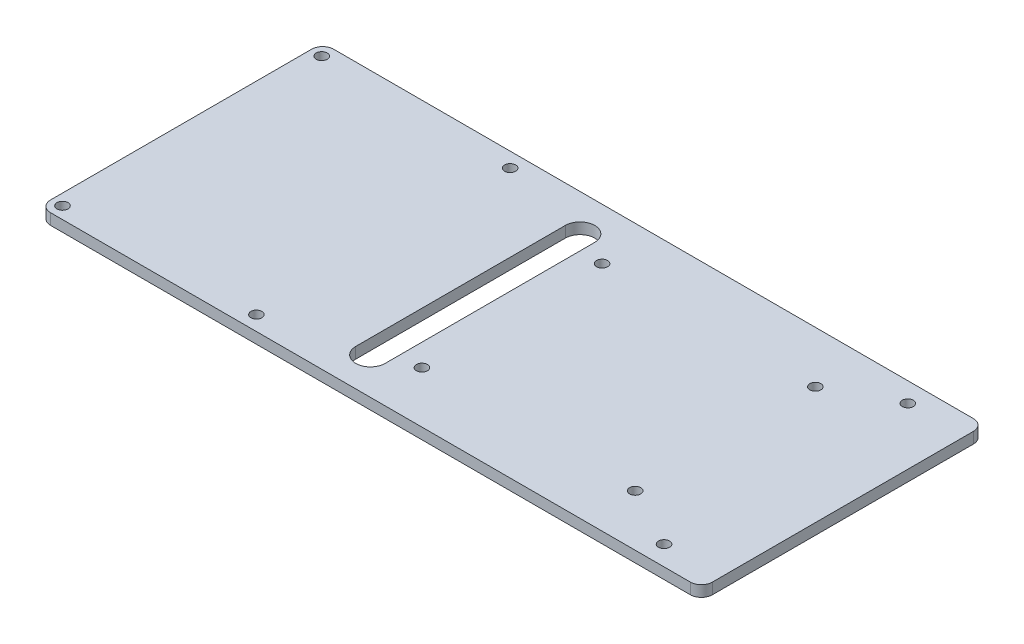
ISO-10303-21;
HEADER;
FILE_DESCRIPTION(('STEP AP214'),'2;1');
FILE_NAME('part.step','',(''),(''),'','','');
FILE_SCHEMA(('AUTOMOTIVE_DESIGN { 1 0 10303 214 1 1 1 1 }'));
ENDSEC;
DATA;
#1=APPLICATION_CONTEXT('core data for automotive mechanical design processes');
#2=APPLICATION_PROTOCOL_DEFINITION('international standard','automotive_design',2000,#1);
#3=PRODUCT_CONTEXT('',#1,'mechanical');
#4=PRODUCT('Part','Part','',(#3));
#5=PRODUCT_RELATED_PRODUCT_CATEGORY('part','',(#4));
#6=PRODUCT_DEFINITION_FORMATION('','',#4);
#7=PRODUCT_DEFINITION_CONTEXT('part definition',#1,'design');
#8=PRODUCT_DEFINITION('design','',#6,#7);
#9=PRODUCT_DEFINITION_SHAPE('','',#8);
#10=(LENGTH_UNIT() NAMED_UNIT(*) SI_UNIT(.MILLI.,.METRE.));
#11=(NAMED_UNIT(*) PLANE_ANGLE_UNIT() SI_UNIT($,.RADIAN.));
#12=(NAMED_UNIT(*) SI_UNIT($,.STERADIAN.) SOLID_ANGLE_UNIT());
#13=UNCERTAINTY_MEASURE_WITH_UNIT(LENGTH_MEASURE(1.E-05),#10,'distance_accuracy_value','');
#14=(GEOMETRIC_REPRESENTATION_CONTEXT(3) GLOBAL_UNCERTAINTY_ASSIGNED_CONTEXT((#13)) GLOBAL_UNIT_ASSIGNED_CONTEXT((#10,
#11,#12)) REPRESENTATION_CONTEXT('',''));
#15=CARTESIAN_POINT('',(0.,0.,0.));
#16=DIRECTION('',(0.,0.,1.));
#17=DIRECTION('',(1.,0.,0.));
#18=AXIS2_PLACEMENT_3D('',#15,#16,#17);
#19=CARTESIAN_POINT('',(0.,3.,0.));
#20=DIRECTION('',(0.,-1.,0.));
#21=DIRECTION('',(0.,0.,-1.));
#22=AXIS2_PLACEMENT_3D('',#19,#20,#21);
#23=PLANE('',#22);
#24=CARTESIAN_POINT('',(58.,3.,-24.5));
#25=DIRECTION('',(0.,-1.,0.));
#26=DIRECTION('',(0.,0.,-1.));
#27=AXIS2_PLACEMENT_3D('',#24,#25,#26);
#28=CIRCLE('',#27,1.5);
#29=CARTESIAN_POINT('',(58.,3.,-26.));
#30=VERTEX_POINT('',#29);
#31=EDGE_CURVE('E164',#30,#30,#28,.F.);
#32=ORIENTED_EDGE('',*,*,#31,.F.);
#33=EDGE_LOOP('',(#32));
#34=FACE_BOUND('',#33,.T.);
#35=CARTESIAN_POINT('',(0.,3.,-24.5));
#36=DIRECTION('',(0.,-1.,0.));
#37=DIRECTION('',(0.,0.,-1.));
#38=AXIS2_PLACEMENT_3D('',#35,#36,#37);
#39=CIRCLE('',#38,1.5);
#40=CARTESIAN_POINT('',(0.,3.,-26.));
#41=VERTEX_POINT('',#40);
#42=EDGE_CURVE('E174',#41,#41,#39,.F.);
#43=ORIENTED_EDGE('',*,*,#42,.F.);
#44=EDGE_LOOP('',(#43));
#45=FACE_BOUND('',#44,.T.);
#46=CARTESIAN_POINT('',(0.,3.,24.5));
#47=DIRECTION('',(0.,-1.,0.));
#48=DIRECTION('',(0.,0.,-1.));
#49=AXIS2_PLACEMENT_3D('',#46,#47,#48);
#50=CIRCLE('',#49,1.5);
#51=CARTESIAN_POINT('',(0.,3.,23.));
#52=VERTEX_POINT('',#51);
#53=EDGE_CURVE('E572',#52,#52,#50,.F.);
#54=ORIENTED_EDGE('',*,*,#53,.F.);
#55=EDGE_LOOP('',(#54));
#56=FACE_BOUND('',#55,.T.);
#57=DIRECTION('',(0.,0.,-1.));
#58=VECTOR('',#57,1.);
#59=CARTESIAN_POINT('',(-5.99999999999999,3.,-28.5));
#60=LINE('',#59,#58);
#61=CARTESIAN_POINT('',(-5.99999999999998,3.,28.5));
#62=VERTEX_POINT('',#61);
#63=CARTESIAN_POINT('',(-5.99999999999999,3.,-28.5));
#64=VERTEX_POINT('',#63);
#65=EDGE_CURVE('E144',#62,#64,#60,.T.);
#66=ORIENTED_EDGE('',*,*,#65,.F.);
#67=CARTESIAN_POINT('',(-9.99999999999998,3.,28.5));
#68=DIRECTION('',(0.,-1.,0.));
#69=DIRECTION('',(0.,0.,-1.));
#70=AXIS2_PLACEMENT_3D('',#67,#68,#69);
#71=CIRCLE('',#70,4.);
#72=CARTESIAN_POINT('',(-14.,3.,28.5));
#73=VERTEX_POINT('',#72);
#74=EDGE_CURVE('E134',#73,#62,#71,.F.);
#75=ORIENTED_EDGE('',*,*,#74,.F.);
#76=DIRECTION('',(0.,0.,1.));
#77=VECTOR('',#76,1.);
#78=CARTESIAN_POINT('',(-14.,3.,28.5));
#79=LINE('',#78,#77);
#80=CARTESIAN_POINT('',(-14.,3.,-28.5));
#81=VERTEX_POINT('',#80);
#82=EDGE_CURVE('E145',#81,#73,#79,.T.);
#83=ORIENTED_EDGE('',*,*,#82,.F.);
#84=CARTESIAN_POINT('',(-9.99999999999999,3.,-28.5));
#85=DIRECTION('',(0.,-1.,0.));
#86=DIRECTION('',(0.,0.,-1.));
#87=AXIS2_PLACEMENT_3D('',#84,#85,#86);
#88=CIRCLE('',#87,4.);
#89=EDGE_CURVE('E154',#64,#81,#88,.F.);
#90=ORIENTED_EDGE('',*,*,#89,.F.);
#91=EDGE_LOOP('',(#66,#75,#83,#90));
#92=FACE_BOUND('',#91,.T.);
#93=CARTESIAN_POINT('',(58.,3.,24.5));
#94=DIRECTION('',(0.,-1.,0.));
#95=DIRECTION('',(0.,0.,-1.));
#96=AXIS2_PLACEMENT_3D('',#93,#94,#95);
#97=CIRCLE('',#96,1.5);
#98=CARTESIAN_POINT('',(58.,3.,23.));
#99=VERTEX_POINT('',#98);
#100=EDGE_CURVE('E185',#99,#99,#97,.F.);
#101=ORIENTED_EDGE('',*,*,#100,.F.);
#102=EDGE_LOOP('',(#101));
#103=FACE_BOUND('',#102,.T.);
#104=DIRECTION('',(-1.,0.,0.));
#105=VECTOR('',#104,1.);
#106=CARTESIAN_POINT('',(-90.,3.,-38.5));
#107=LINE('',#106,#105);
#108=CARTESIAN_POINT('',(86.9999999999999,3.,-38.5));
#109=VERTEX_POINT('',#108);
#110=CARTESIAN_POINT('',(-87.,3.,-38.5));
#111=VERTEX_POINT('',#110);
#112=EDGE_CURVE('E242',#109,#111,#107,.T.);
#113=ORIENTED_EDGE('',*,*,#112,.T.);
#114=CARTESIAN_POINT('',(-87.,3.,-35.5));
#115=DIRECTION('',(0.,-1.,0.));
#116=DIRECTION('',(0.,0.,-1.));
#117=AXIS2_PLACEMENT_3D('',#114,#115,#116);
#118=CIRCLE('',#117,3.);
#119=CARTESIAN_POINT('',(-90.,3.,-35.4999999999999));
#120=VERTEX_POINT('',#119);
#121=EDGE_CURVE('E304',#111,#120,#118,.F.);
#122=ORIENTED_EDGE('',*,*,#121,.T.);
#123=DIRECTION('',(0.,0.,1.));
#124=VECTOR('',#123,1.);
#125=CARTESIAN_POINT('',(-90.,3.,38.5));
#126=LINE('',#125,#124);
#127=CARTESIAN_POINT('',(-90.,3.,35.5));
#128=VERTEX_POINT('',#127);
#129=EDGE_CURVE('E247',#120,#128,#126,.T.);
#130=ORIENTED_EDGE('',*,*,#129,.T.);
#131=CARTESIAN_POINT('',(-87.,3.,35.5));
#132=DIRECTION('',(0.,-1.,0.));
#133=DIRECTION('',(0.,0.,-1.));
#134=AXIS2_PLACEMENT_3D('',#131,#132,#133);
#135=CIRCLE('',#134,3.);
#136=CARTESIAN_POINT('',(-87.,3.,38.5));
#137=VERTEX_POINT('',#136);
#138=EDGE_CURVE('E301',#128,#137,#135,.F.);
#139=ORIENTED_EDGE('',*,*,#138,.T.);
#140=DIRECTION('',(1.,0.,0.));
#141=VECTOR('',#140,1.);
#142=CARTESIAN_POINT('',(-90.,3.,38.5));
#143=LINE('',#142,#141);
#144=CARTESIAN_POINT('',(87.,3.,38.5));
#145=VERTEX_POINT('',#144);
#146=EDGE_CURVE('E251',#137,#145,#143,.T.);
#147=ORIENTED_EDGE('',*,*,#146,.T.);
#148=CARTESIAN_POINT('',(87.,3.,35.5));
#149=DIRECTION('',(0.,-1.,0.));
#150=DIRECTION('',(0.,0.,-1.));
#151=AXIS2_PLACEMENT_3D('',#148,#149,#150);
#152=CIRCLE('',#151,3.);
#153=CARTESIAN_POINT('',(90.,3.,35.5));
#154=VERTEX_POINT('',#153);
#155=EDGE_CURVE('E298',#145,#154,#152,.F.);
#156=ORIENTED_EDGE('',*,*,#155,.T.);
#157=DIRECTION('',(0.,0.,-1.));
#158=VECTOR('',#157,1.);
#159=CARTESIAN_POINT('',(90.,3.,38.5));
#160=LINE('',#159,#158);
#161=CARTESIAN_POINT('',(90.,3.,-35.5));
#162=VERTEX_POINT('',#161);
#163=EDGE_CURVE('E238',#154,#162,#160,.T.);
#164=ORIENTED_EDGE('',*,*,#163,.T.);
#165=CARTESIAN_POINT('',(87.,3.,-35.5));
#166=DIRECTION('',(0.,-1.,0.));
#167=DIRECTION('',(0.,0.,-1.));
#168=AXIS2_PLACEMENT_3D('',#165,#166,#167);
#169=CIRCLE('',#168,3.);
#170=EDGE_CURVE('E295',#162,#109,#169,.F.);
#171=ORIENTED_EDGE('',*,*,#170,.T.);
#172=EDGE_LOOP('',(#113,#122,#130,#139,#147,#156,#164,#171));
#173=FACE_BOUND('',#172,.T.);
#174=CARTESIAN_POINT('',(-87.,3.,-35.25));
#175=DIRECTION('',(0.,1.,0.));
#176=DIRECTION('',(0.,0.,1.));
#177=AXIS2_PLACEMENT_3D('',#174,#175,#176);
#178=CIRCLE('',#177,1.5);
#179=CARTESIAN_POINT('',(-87.,3.,-33.75));
#180=VERTEX_POINT('',#179);
#181=EDGE_CURVE('E230',#180,#180,#178,.T.);
#182=ORIENTED_EDGE('',*,*,#181,.F.);
#183=EDGE_LOOP('',(#182));
#184=FACE_BOUND('',#183,.T.);
#185=CARTESIAN_POINT('',(-87.,3.,35.25));
#186=DIRECTION('',(0.,1.,0.));
#187=DIRECTION('',(0.,0.,-1.));
#188=AXIS2_PLACEMENT_3D('',#185,#186,#187);
#189=CIRCLE('',#188,1.5);
#190=CARTESIAN_POINT('',(-87.,3.,33.75));
#191=VERTEX_POINT('',#190);
#192=EDGE_CURVE('E222',#191,#191,#189,.T.);
#193=ORIENTED_EDGE('',*,*,#192,.F.);
#194=EDGE_LOOP('',(#193));
#195=FACE_BOUND('',#194,.T.);
#196=CARTESIAN_POINT('',(-35.0054089351594,3.,-34.5));
#197=DIRECTION('',(0.,1.,0.));
#198=DIRECTION('',(0.,0.,1.));
#199=AXIS2_PLACEMENT_3D('',#196,#197,#198);
#200=CIRCLE('',#199,1.5);
#201=CARTESIAN_POINT('',(-35.0054089351594,3.,-33.));
#202=VERTEX_POINT('',#201);
#203=EDGE_CURVE('E214',#202,#202,#200,.T.);
#204=ORIENTED_EDGE('',*,*,#203,.F.);
#205=EDGE_LOOP('',(#204));
#206=FACE_BOUND('',#205,.T.);
#207=CARTESIAN_POINT('',(-35.0054089351594,3.,34.5));
#208=DIRECTION('',(0.,1.,0.));
#209=DIRECTION('',(0.,0.,-1.));
#210=AXIS2_PLACEMENT_3D('',#207,#208,#209);
#211=CIRCLE('',#210,1.5);
#212=CARTESIAN_POINT('',(-35.0054089351594,3.,33.));
#213=VERTEX_POINT('',#212);
#214=EDGE_CURVE('E206',#213,#213,#211,.T.);
#215=ORIENTED_EDGE('',*,*,#214,.F.);
#216=EDGE_LOOP('',(#215));
#217=FACE_BOUND('',#216,.T.);
#218=CARTESIAN_POINT('',(74.4945910648406,3.,-33.15));
#219=DIRECTION('',(0.,1.,0.));
#220=DIRECTION('',(0.,0.,1.));
#221=AXIS2_PLACEMENT_3D('',#218,#219,#220);
#222=CIRCLE('',#221,1.5007423756023);
#223=CARTESIAN_POINT('',(74.4945910648406,3.,-31.6492576243977));
#224=VERTEX_POINT('',#223);
#225=EDGE_CURVE('E198',#224,#224,#222,.T.);
#226=ORIENTED_EDGE('',*,*,#225,.F.);
#227=EDGE_LOOP('',(#226));
#228=FACE_BOUND('',#227,.T.);
#229=CARTESIAN_POINT('',(74.4945910648406,3.,33.15));
#230=DIRECTION('',(0.,1.,0.));
#231=DIRECTION('',(0.,0.,1.));
#232=AXIS2_PLACEMENT_3D('',#229,#230,#231);
#233=CIRCLE('',#232,1.5);
#234=CARTESIAN_POINT('',(74.4945910648406,3.,34.65));
#235=VERTEX_POINT('',#234);
#236=EDGE_CURVE('E190',#235,#235,#233,.T.);
#237=ORIENTED_EDGE('',*,*,#236,.F.);
#238=EDGE_LOOP('',(#237));
#239=FACE_BOUND('',#238,.T.);
#240=ADVANCED_FACE('F45',(#34,#45,#56,#92,#103,#173,#184,#195,#206,#217,#228,#239),#23,.F.);
#241=CARTESIAN_POINT('',(0.,0.,0.));
#242=DIRECTION('',(0.,-1.,0.));
#243=DIRECTION('',(0.,0.,-1.));
#244=AXIS2_PLACEMENT_3D('',#241,#242,#243);
#245=PLANE('',#244);
#246=CARTESIAN_POINT('',(58.,0.,-24.5));
#247=DIRECTION('',(0.,-1.,0.));
#248=DIRECTION('',(0.,0.,-1.));
#249=AXIS2_PLACEMENT_3D('',#246,#247,#248);
#250=CIRCLE('',#249,1.5);
#251=CARTESIAN_POINT('',(58.,0.,-26.));
#252=VERTEX_POINT('',#251);
#253=EDGE_CURVE('E168',#252,#252,#250,.T.);
#254=ORIENTED_EDGE('',*,*,#253,.F.);
#255=EDGE_LOOP('',(#254));
#256=FACE_BOUND('',#255,.T.);
#257=CARTESIAN_POINT('',(0.,0.,-24.5));
#258=DIRECTION('',(0.,-1.,0.));
#259=DIRECTION('',(0.,0.,-1.));
#260=AXIS2_PLACEMENT_3D('',#257,#258,#259);
#261=CIRCLE('',#260,1.5);
#262=CARTESIAN_POINT('',(0.,0.,-26.));
#263=VERTEX_POINT('',#262);
#264=EDGE_CURVE('E169',#263,#263,#261,.T.);
#265=ORIENTED_EDGE('',*,*,#264,.F.);
#266=EDGE_LOOP('',(#265));
#267=FACE_BOUND('',#266,.T.);
#268=CARTESIAN_POINT('',(0.,0.,24.5));
#269=DIRECTION('',(0.,-1.,0.));
#270=DIRECTION('',(0.,0.,-1.));
#271=AXIS2_PLACEMENT_3D('',#268,#269,#270);
#272=CIRCLE('',#271,1.5);
#273=CARTESIAN_POINT('',(0.,0.,23.));
#274=VERTEX_POINT('',#273);
#275=EDGE_CURVE('E178',#274,#274,#272,.T.);
#276=ORIENTED_EDGE('',*,*,#275,.F.);
#277=EDGE_LOOP('',(#276));
#278=FACE_BOUND('',#277,.T.);
#279=CARTESIAN_POINT('',(-9.99999999999998,0.,28.5));
#280=DIRECTION('',(0.,-1.,0.));
#281=DIRECTION('',(0.,0.,-1.));
#282=AXIS2_PLACEMENT_3D('',#279,#280,#281);
#283=CIRCLE('',#282,4.);
#284=CARTESIAN_POINT('',(-5.99999999999998,0.,28.5));
#285=VERTEX_POINT('',#284);
#286=CARTESIAN_POINT('',(-14.,0.,28.5));
#287=VERTEX_POINT('',#286);
#288=EDGE_CURVE('E69',#285,#287,#283,.T.);
#289=ORIENTED_EDGE('',*,*,#288,.F.);
#290=DIRECTION('',(0.,0.,1.));
#291=VECTOR('',#290,1.);
#292=CARTESIAN_POINT('',(-5.99999999999999,0.,-28.5));
#293=LINE('',#292,#291);
#294=CARTESIAN_POINT('',(-5.99999999999999,0.,-28.5));
#295=VERTEX_POINT('',#294);
#296=EDGE_CURVE('E151',#295,#285,#293,.T.);
#297=ORIENTED_EDGE('',*,*,#296,.F.);
#298=CARTESIAN_POINT('',(-9.99999999999999,0.,-28.5));
#299=DIRECTION('',(0.,-1.,0.));
#300=DIRECTION('',(0.,0.,-1.));
#301=AXIS2_PLACEMENT_3D('',#298,#299,#300);
#302=CIRCLE('',#301,4.);
#303=CARTESIAN_POINT('',(-14.,0.,-28.5));
#304=VERTEX_POINT('',#303);
#305=EDGE_CURVE('E577',#304,#295,#302,.T.);
#306=ORIENTED_EDGE('',*,*,#305,.F.);
#307=DIRECTION('',(0.,0.,-1.));
#308=VECTOR('',#307,1.);
#309=CARTESIAN_POINT('',(-14.,0.,28.5));
#310=LINE('',#309,#308);
#311=EDGE_CURVE('E570',#287,#304,#310,.T.);
#312=ORIENTED_EDGE('',*,*,#311,.F.);
#313=EDGE_LOOP('',(#289,#297,#306,#312));
#314=FACE_BOUND('',#313,.T.);
#315=CARTESIAN_POINT('',(58.,0.,24.5));
#316=DIRECTION('',(0.,-1.,0.));
#317=DIRECTION('',(0.,0.,-1.));
#318=AXIS2_PLACEMENT_3D('',#315,#316,#317);
#319=CIRCLE('',#318,1.5);
#320=CARTESIAN_POINT('',(58.,0.,23.));
#321=VERTEX_POINT('',#320);
#322=EDGE_CURVE('E173',#321,#321,#319,.T.);
#323=ORIENTED_EDGE('',*,*,#322,.F.);
#324=EDGE_LOOP('',(#323));
#325=FACE_BOUND('',#324,.T.);
#326=CARTESIAN_POINT('',(74.4945910648406,0.,-33.15));
#327=DIRECTION('',(0.,1.,0.));
#328=DIRECTION('',(0.,0.,1.));
#329=AXIS2_PLACEMENT_3D('',#326,#327,#328);
#330=CIRCLE('',#329,1.5007423756023);
#331=CARTESIAN_POINT('',(74.4945910648406,0.,-31.6492576243977));
#332=VERTEX_POINT('',#331);
#333=EDGE_CURVE('E194',#332,#332,#330,.T.);
#334=ORIENTED_EDGE('',*,*,#333,.T.);
#335=EDGE_LOOP('',(#334));
#336=FACE_BOUND('',#335,.T.);
#337=CARTESIAN_POINT('',(-35.0054089351594,0.,-34.5));
#338=DIRECTION('',(0.,1.,0.));
#339=DIRECTION('',(0.,0.,1.));
#340=AXIS2_PLACEMENT_3D('',#337,#338,#339);
#341=CIRCLE('',#340,1.5);
#342=CARTESIAN_POINT('',(-35.0054089351594,0.,-33.));
#343=VERTEX_POINT('',#342);
#344=EDGE_CURVE('E210',#343,#343,#341,.T.);
#345=ORIENTED_EDGE('',*,*,#344,.T.);
#346=EDGE_LOOP('',(#345));
#347=FACE_BOUND('',#346,.T.);
#348=CARTESIAN_POINT('',(-87.,0.,-35.25));
#349=DIRECTION('',(0.,1.,0.));
#350=DIRECTION('',(0.,0.,1.));
#351=AXIS2_PLACEMENT_3D('',#348,#349,#350);
#352=CIRCLE('',#351,1.5);
#353=CARTESIAN_POINT('',(-87.,0.,-33.75));
#354=VERTEX_POINT('',#353);
#355=EDGE_CURVE('E226',#354,#354,#352,.T.);
#356=ORIENTED_EDGE('',*,*,#355,.T.);
#357=EDGE_LOOP('',(#356));
#358=FACE_BOUND('',#357,.T.);
#359=DIRECTION('',(0.,0.,1.));
#360=VECTOR('',#359,1.);
#361=CARTESIAN_POINT('',(-90.,0.,38.5));
#362=LINE('',#361,#360);
#363=CARTESIAN_POINT('',(-90.,0.,-35.4999999999999));
#364=VERTEX_POINT('',#363);
#365=CARTESIAN_POINT('',(-90.,0.,35.5));
#366=VERTEX_POINT('',#365);
#367=EDGE_CURVE('E263',#364,#366,#362,.T.);
#368=ORIENTED_EDGE('',*,*,#367,.F.);
#369=CARTESIAN_POINT('',(-87.,0.,-35.5));
#370=DIRECTION('',(0.,-1.,0.));
#371=DIRECTION('',(0.,0.,-1.));
#372=AXIS2_PLACEMENT_3D('',#369,#370,#371);
#373=CIRCLE('',#372,3.);
#374=CARTESIAN_POINT('',(-87.,0.,-38.5));
#375=VERTEX_POINT('',#374);
#376=EDGE_CURVE('E285',#364,#375,#373,.T.);
#377=ORIENTED_EDGE('',*,*,#376,.T.);
#378=DIRECTION('',(-1.,0.,0.));
#379=VECTOR('',#378,1.);
#380=CARTESIAN_POINT('',(-90.,0.,-38.5));
#381=LINE('',#380,#379);
#382=CARTESIAN_POINT('',(86.9999999999999,0.,-38.5));
#383=VERTEX_POINT('',#382);
#384=EDGE_CURVE('E259',#383,#375,#381,.T.);
#385=ORIENTED_EDGE('',*,*,#384,.F.);
#386=CARTESIAN_POINT('',(87.,0.,-35.5));
#387=DIRECTION('',(0.,-1.,0.));
#388=DIRECTION('',(0.,0.,-1.));
#389=AXIS2_PLACEMENT_3D('',#386,#387,#388);
#390=CIRCLE('',#389,3.);
#391=CARTESIAN_POINT('',(90.,0.,-35.5));
#392=VERTEX_POINT('',#391);
#393=EDGE_CURVE('E276',#383,#392,#390,.T.);
#394=ORIENTED_EDGE('',*,*,#393,.T.);
#395=DIRECTION('',(0.,0.,-1.));
#396=VECTOR('',#395,1.);
#397=CARTESIAN_POINT('',(90.,0.,38.5));
#398=LINE('',#397,#396);
#399=CARTESIAN_POINT('',(90.,0.,35.5));
#400=VERTEX_POINT('',#399);
#401=EDGE_CURVE('E234',#400,#392,#398,.T.);
#402=ORIENTED_EDGE('',*,*,#401,.F.);
#403=CARTESIAN_POINT('',(87.,0.,35.5));
#404=DIRECTION('',(0.,-1.,0.));
#405=DIRECTION('',(0.,0.,-1.));
#406=AXIS2_PLACEMENT_3D('',#403,#404,#405);
#407=CIRCLE('',#406,3.);
#408=CARTESIAN_POINT('',(87.,0.,38.5));
#409=VERTEX_POINT('',#408);
#410=EDGE_CURVE('E279',#400,#409,#407,.T.);
#411=ORIENTED_EDGE('',*,*,#410,.T.);
#412=DIRECTION('',(1.,0.,0.));
#413=VECTOR('',#412,1.);
#414=CARTESIAN_POINT('',(-90.,0.,38.5));
#415=LINE('',#414,#413);
#416=CARTESIAN_POINT('',(-87.,0.,38.5));
#417=VERTEX_POINT('',#416);
#418=EDGE_CURVE('E243',#417,#409,#415,.T.);
#419=ORIENTED_EDGE('',*,*,#418,.F.);
#420=CARTESIAN_POINT('',(-87.,0.,35.5));
#421=DIRECTION('',(0.,-1.,0.));
#422=DIRECTION('',(0.,0.,-1.));
#423=AXIS2_PLACEMENT_3D('',#420,#421,#422);
#424=CIRCLE('',#423,3.);
#425=EDGE_CURVE('E282',#417,#366,#424,.T.);
#426=ORIENTED_EDGE('',*,*,#425,.T.);
#427=EDGE_LOOP('',(#368,#377,#385,#394,#402,#411,#419,#426));
#428=FACE_BOUND('',#427,.T.);
#429=CARTESIAN_POINT('',(-87.,0.,35.25));
#430=DIRECTION('',(0.,1.,0.));
#431=DIRECTION('',(0.,0.,-1.));
#432=AXIS2_PLACEMENT_3D('',#429,#430,#431);
#433=CIRCLE('',#432,1.5);
#434=CARTESIAN_POINT('',(-87.,0.,33.75));
#435=VERTEX_POINT('',#434);
#436=EDGE_CURVE('E218',#435,#435,#433,.T.);
#437=ORIENTED_EDGE('',*,*,#436,.T.);
#438=EDGE_LOOP('',(#437));
#439=FACE_BOUND('',#438,.T.);
#440=CARTESIAN_POINT('',(-35.0054089351594,0.,34.5));
#441=DIRECTION('',(0.,1.,0.));
#442=DIRECTION('',(0.,0.,-1.));
#443=AXIS2_PLACEMENT_3D('',#440,#441,#442);
#444=CIRCLE('',#443,1.5);
#445=CARTESIAN_POINT('',(-35.0054089351594,0.,33.));
#446=VERTEX_POINT('',#445);
#447=EDGE_CURVE('E202',#446,#446,#444,.T.);
#448=ORIENTED_EDGE('',*,*,#447,.T.);
#449=EDGE_LOOP('',(#448));
#450=FACE_BOUND('',#449,.T.);
#451=CARTESIAN_POINT('',(74.4945910648406,0.,33.15));
#452=DIRECTION('',(0.,1.,0.));
#453=DIRECTION('',(0.,0.,1.));
#454=AXIS2_PLACEMENT_3D('',#451,#452,#453);
#455=CIRCLE('',#454,1.5);
#456=CARTESIAN_POINT('',(74.4945910648406,0.,34.65));
#457=VERTEX_POINT('',#456);
#458=EDGE_CURVE('E189',#457,#457,#455,.T.);
#459=ORIENTED_EDGE('',*,*,#458,.T.);
#460=EDGE_LOOP('',(#459));
#461=FACE_BOUND('',#460,.T.);
#462=ADVANCED_FACE('F333',(#256,#267,#278,#314,#325,#336,#347,#358,#428,#439,#450,#461),#245,.T.);
#463=CARTESIAN_POINT('',(90.,3.,38.5));
#464=DIRECTION('',(-1.,0.,0.));
#465=DIRECTION('',(0.,0.,1.));
#466=AXIS2_PLACEMENT_3D('',#463,#464,#465);
#467=PLANE('',#466);
#468=ORIENTED_EDGE('',*,*,#163,.F.);
#469=DIRECTION('',(0.,-1.,0.));
#470=VECTOR('',#469,1.);
#471=CARTESIAN_POINT('',(90.,3.,35.5));
#472=LINE('',#471,#470);
#473=EDGE_CURVE('E11',#154,#400,#472,.T.);
#474=ORIENTED_EDGE('',*,*,#473,.T.);
#475=ORIENTED_EDGE('',*,*,#401,.T.);
#476=DIRECTION('',(0.,-1.,0.));
#477=VECTOR('',#476,1.);
#478=CARTESIAN_POINT('',(90.,3.,-35.5));
#479=LINE('',#478,#477);
#480=EDGE_CURVE('E54',#392,#162,#479,.F.);
#481=ORIENTED_EDGE('',*,*,#480,.T.);
#482=EDGE_LOOP('',(#468,#474,#475,#481));
#483=FACE_BOUND('',#482,.T.);
#484=ADVANCED_FACE('F317',(#483),#467,.F.);
#485=CARTESIAN_POINT('',(-90.,3.,-38.5));
#486=DIRECTION('',(0.,0.,1.));
#487=DIRECTION('',(1.,0.,0.));
#488=AXIS2_PLACEMENT_3D('',#485,#486,#487);
#489=PLANE('',#488);
#490=ORIENTED_EDGE('',*,*,#384,.T.);
#491=DIRECTION('',(0.,-1.,0.));
#492=VECTOR('',#491,1.);
#493=CARTESIAN_POINT('',(-87.,3.,-38.5));
#494=LINE('',#493,#492);
#495=EDGE_CURVE('E292',#375,#111,#494,.F.);
#496=ORIENTED_EDGE('',*,*,#495,.T.);
#497=ORIENTED_EDGE('',*,*,#112,.F.);
#498=DIRECTION('',(0.,-1.,0.));
#499=VECTOR('',#498,1.);
#500=CARTESIAN_POINT('',(87.,3.,-38.5));
#501=LINE('',#500,#499);
#502=EDGE_CURVE('E288',#109,#383,#501,.T.);
#503=ORIENTED_EDGE('',*,*,#502,.T.);
#504=EDGE_LOOP('',(#490,#496,#497,#503));
#505=FACE_BOUND('',#504,.T.);
#506=ADVANCED_FACE('F329',(#505),#489,.F.);
#507=CARTESIAN_POINT('',(-90.,3.,38.5));
#508=DIRECTION('',(1.,0.,0.));
#509=DIRECTION('',(0.,0.,-1.));
#510=AXIS2_PLACEMENT_3D('',#507,#508,#509);
#511=PLANE('',#510);
#512=ORIENTED_EDGE('',*,*,#129,.F.);
#513=DIRECTION('',(0.,-1.,0.));
#514=VECTOR('',#513,1.);
#515=CARTESIAN_POINT('',(-90.,3.,-35.5));
#516=LINE('',#515,#514);
#517=EDGE_CURVE('E272',#120,#364,#516,.T.);
#518=ORIENTED_EDGE('',*,*,#517,.T.);
#519=ORIENTED_EDGE('',*,*,#367,.T.);
#520=DIRECTION('',(0.,-1.,0.));
#521=VECTOR('',#520,1.);
#522=CARTESIAN_POINT('',(-90.,3.,35.5));
#523=LINE('',#522,#521);
#524=EDGE_CURVE('E255',#366,#128,#523,.F.);
#525=ORIENTED_EDGE('',*,*,#524,.T.);
#526=EDGE_LOOP('',(#512,#518,#519,#525));
#527=FACE_BOUND('',#526,.T.);
#528=ADVANCED_FACE('F341',(#527),#511,.F.);
#529=CARTESIAN_POINT('',(-90.,3.,38.5));
#530=DIRECTION('',(0.,0.,-1.));
#531=DIRECTION('',(-1.,0.,0.));
#532=AXIS2_PLACEMENT_3D('',#529,#530,#531);
#533=PLANE('',#532);
#534=ORIENTED_EDGE('',*,*,#146,.F.);
#535=DIRECTION('',(0.,-1.,0.));
#536=VECTOR('',#535,1.);
#537=CARTESIAN_POINT('',(-87.,3.,38.5));
#538=LINE('',#537,#536);
#539=EDGE_CURVE('E310',#137,#417,#538,.T.);
#540=ORIENTED_EDGE('',*,*,#539,.T.);
#541=ORIENTED_EDGE('',*,*,#418,.T.);
#542=DIRECTION('',(0.,-1.,0.));
#543=VECTOR('',#542,1.);
#544=CARTESIAN_POINT('',(87.,3.,38.5));
#545=LINE('',#544,#543);
#546=EDGE_CURVE('E307',#409,#145,#545,.F.);
#547=ORIENTED_EDGE('',*,*,#546,.T.);
#548=EDGE_LOOP('',(#534,#540,#541,#547));
#549=FACE_BOUND('',#548,.T.);
#550=ADVANCED_FACE('F350',(#549),#533,.F.);
#551=CARTESIAN_POINT('',(-87.,3.,-35.25));
#552=DIRECTION('',(0.,-1.,0.));
#553=DIRECTION('',(0.,0.,-1.));
#554=AXIS2_PLACEMENT_3D('',#551,#552,#553);
#555=CYLINDRICAL_SURFACE('',#554,1.5);
#556=ORIENTED_EDGE('',*,*,#181,.T.);
#557=EDGE_LOOP('',(#556));
#558=FACE_BOUND('',#557,.T.);
#559=ORIENTED_EDGE('',*,*,#355,.F.);
#560=EDGE_LOOP('',(#559));
#561=FACE_BOUND('',#560,.T.);
#562=ADVANCED_FACE('F372',(#558,#561),#555,.F.);
#563=CARTESIAN_POINT('',(-87.,3.,35.25));
#564=DIRECTION('',(0.,-1.,0.));
#565=DIRECTION('',(0.,0.,-1.));
#566=AXIS2_PLACEMENT_3D('',#563,#564,#565);
#567=CYLINDRICAL_SURFACE('',#566,1.5);
#568=ORIENTED_EDGE('',*,*,#192,.T.);
#569=EDGE_LOOP('',(#568));
#570=FACE_BOUND('',#569,.T.);
#571=ORIENTED_EDGE('',*,*,#436,.F.);
#572=EDGE_LOOP('',(#571));
#573=FACE_BOUND('',#572,.T.);
#574=ADVANCED_FACE('F406',(#570,#573),#567,.F.);
#575=CARTESIAN_POINT('',(-35.0054089351594,3.,-34.5));
#576=DIRECTION('',(0.,-1.,0.));
#577=DIRECTION('',(0.,0.,-1.));
#578=AXIS2_PLACEMENT_3D('',#575,#576,#577);
#579=CYLINDRICAL_SURFACE('',#578,1.5);
#580=ORIENTED_EDGE('',*,*,#203,.T.);
#581=EDGE_LOOP('',(#580));
#582=FACE_BOUND('',#581,.T.);
#583=ORIENTED_EDGE('',*,*,#344,.F.);
#584=EDGE_LOOP('',(#583));
#585=FACE_BOUND('',#584,.T.);
#586=ADVANCED_FACE('F403',(#582,#585),#579,.F.);
#587=CARTESIAN_POINT('',(-35.0054089351594,3.,34.5));
#588=DIRECTION('',(0.,-1.,0.));
#589=DIRECTION('',(0.,0.,-1.));
#590=AXIS2_PLACEMENT_3D('',#587,#588,#589);
#591=CYLINDRICAL_SURFACE('',#590,1.5);
#592=ORIENTED_EDGE('',*,*,#214,.T.);
#593=EDGE_LOOP('',(#592));
#594=FACE_BOUND('',#593,.T.);
#595=ORIENTED_EDGE('',*,*,#447,.F.);
#596=EDGE_LOOP('',(#595));
#597=FACE_BOUND('',#596,.T.);
#598=ADVANCED_FACE('F394',(#594,#597),#591,.F.);
#599=CARTESIAN_POINT('',(74.4945910648406,3.,-33.15));
#600=DIRECTION('',(0.,-1.,0.));
#601=DIRECTION('',(0.,0.,-1.));
#602=AXIS2_PLACEMENT_3D('',#599,#600,#601);
#603=CYLINDRICAL_SURFACE('',#602,1.5007423756023);
#604=ORIENTED_EDGE('',*,*,#225,.T.);
#605=EDGE_LOOP('',(#604));
#606=FACE_BOUND('',#605,.T.);
#607=ORIENTED_EDGE('',*,*,#333,.F.);
#608=EDGE_LOOP('',(#607));
#609=FACE_BOUND('',#608,.T.);
#610=ADVANCED_FACE('F388',(#606,#609),#603,.F.);
#611=CARTESIAN_POINT('',(74.4945910648406,3.,33.15));
#612=DIRECTION('',(0.,-1.,0.));
#613=DIRECTION('',(0.,0.,-1.));
#614=AXIS2_PLACEMENT_3D('',#611,#612,#613);
#615=CYLINDRICAL_SURFACE('',#614,1.5);
#616=ORIENTED_EDGE('',*,*,#236,.T.);
#617=EDGE_LOOP('',(#616));
#618=FACE_BOUND('',#617,.T.);
#619=ORIENTED_EDGE('',*,*,#458,.F.);
#620=EDGE_LOOP('',(#619));
#621=FACE_BOUND('',#620,.T.);
#622=ADVANCED_FACE('F384',(#618,#621),#615,.F.);
#623=CARTESIAN_POINT('',(-87.,3.,-35.5));
#624=DIRECTION('',(0.,-1.,0.));
#625=DIRECTION('',(0.,0.,-1.));
#626=AXIS2_PLACEMENT_3D('',#623,#624,#625);
#627=CYLINDRICAL_SURFACE('',#626,3.);
#628=ORIENTED_EDGE('',*,*,#121,.F.);
#629=ORIENTED_EDGE('',*,*,#495,.F.);
#630=ORIENTED_EDGE('',*,*,#376,.F.);
#631=ORIENTED_EDGE('',*,*,#517,.F.);
#632=EDGE_LOOP('',(#628,#629,#630,#631));
#633=FACE_BOUND('',#632,.T.);
#634=ADVANCED_FACE('F338',(#633),#627,.T.);
#635=CARTESIAN_POINT('',(-87.,3.,35.5));
#636=DIRECTION('',(0.,-1.,0.));
#637=DIRECTION('',(0.,0.,-1.));
#638=AXIS2_PLACEMENT_3D('',#635,#636,#637);
#639=CYLINDRICAL_SURFACE('',#638,3.);
#640=ORIENTED_EDGE('',*,*,#138,.F.);
#641=ORIENTED_EDGE('',*,*,#524,.F.);
#642=ORIENTED_EDGE('',*,*,#425,.F.);
#643=ORIENTED_EDGE('',*,*,#539,.F.);
#644=EDGE_LOOP('',(#640,#641,#642,#643));
#645=FACE_BOUND('',#644,.T.);
#646=ADVANCED_FACE('F347',(#645),#639,.T.);
#647=CARTESIAN_POINT('',(87.,3.,35.5));
#648=DIRECTION('',(0.,-1.,0.));
#649=DIRECTION('',(0.,0.,-1.));
#650=AXIS2_PLACEMENT_3D('',#647,#648,#649);
#651=CYLINDRICAL_SURFACE('',#650,3.);
#652=ORIENTED_EDGE('',*,*,#155,.F.);
#653=ORIENTED_EDGE('',*,*,#546,.F.);
#654=ORIENTED_EDGE('',*,*,#410,.F.);
#655=ORIENTED_EDGE('',*,*,#473,.F.);
#656=EDGE_LOOP('',(#652,#653,#654,#655));
#657=FACE_BOUND('',#656,.T.);
#658=ADVANCED_FACE('F353',(#657),#651,.T.);
#659=CARTESIAN_POINT('',(87.,3.,-35.5));
#660=DIRECTION('',(0.,-1.,0.));
#661=DIRECTION('',(0.,0.,-1.));
#662=AXIS2_PLACEMENT_3D('',#659,#660,#661);
#663=CYLINDRICAL_SURFACE('',#662,3.);
#664=ORIENTED_EDGE('',*,*,#170,.F.);
#665=ORIENTED_EDGE('',*,*,#480,.F.);
#666=ORIENTED_EDGE('',*,*,#393,.F.);
#667=ORIENTED_EDGE('',*,*,#502,.F.);
#668=EDGE_LOOP('',(#664,#665,#666,#667));
#669=FACE_BOUND('',#668,.T.);
#670=ADVANCED_FACE('F47',(#669),#663,.T.);
#671=CARTESIAN_POINT('',(58.,68.4904573201318,24.5));
#672=DIRECTION('',(0.,-1.,0.));
#673=DIRECTION('',(0.,0.,-1.));
#674=AXIS2_PLACEMENT_3D('',#671,#672,#673);
#675=CYLINDRICAL_SURFACE('',#674,1.5);
#676=ORIENTED_EDGE('',*,*,#100,.T.);
#677=EDGE_LOOP('',(#676));
#678=FACE_BOUND('',#677,.T.);
#679=ORIENTED_EDGE('',*,*,#322,.T.);
#680=EDGE_LOOP('',(#679));
#681=FACE_BOUND('',#680,.T.);
#682=ADVANCED_FACE('F359',(#678,#681),#675,.F.);
#683=CARTESIAN_POINT('',(-9.99999999999998,68.4904573201318,28.5));
#684=DIRECTION('',(0.,-1.,0.));
#685=DIRECTION('',(0.,0.,-1.));
#686=AXIS2_PLACEMENT_3D('',#683,#684,#685);
#687=CYLINDRICAL_SURFACE('',#686,4.);
#688=ORIENTED_EDGE('',*,*,#74,.T.);
#689=DIRECTION('',(0.,-1.,0.));
#690=VECTOR('',#689,1.);
#691=CARTESIAN_POINT('',(-5.99999999999998,68.4904573201318,28.5));
#692=LINE('',#691,#690);
#693=EDGE_CURVE('E137',#62,#285,#692,.T.);
#694=ORIENTED_EDGE('',*,*,#693,.T.);
#695=ORIENTED_EDGE('',*,*,#288,.T.);
#696=DIRECTION('',(0.,-1.,0.));
#697=VECTOR('',#696,1.);
#698=CARTESIAN_POINT('',(-14.,68.4904573201318,28.5));
#699=LINE('',#698,#697);
#700=EDGE_CURVE('E139',#73,#287,#699,.T.);
#701=ORIENTED_EDGE('',*,*,#700,.F.);
#702=EDGE_LOOP('',(#688,#694,#695,#701));
#703=FACE_BOUND('',#702,.T.);
#704=ADVANCED_FACE('F136',(#703),#687,.F.);
#705=CARTESIAN_POINT('',(-5.99999999999999,68.4904573201318,-28.5));
#706=DIRECTION('',(1.,0.,0.));
#707=DIRECTION('',(0.,0.,-1.));
#708=AXIS2_PLACEMENT_3D('',#705,#706,#707);
#709=PLANE('',#708);
#710=ORIENTED_EDGE('',*,*,#65,.T.);
#711=DIRECTION('',(0.,-1.,0.));
#712=VECTOR('',#711,1.);
#713=CARTESIAN_POINT('',(-5.99999999999999,68.4904573201318,-28.5));
#714=LINE('',#713,#712);
#715=EDGE_CURVE('E153',#64,#295,#714,.T.);
#716=ORIENTED_EDGE('',*,*,#715,.T.);
#717=ORIENTED_EDGE('',*,*,#296,.T.);
#718=ORIENTED_EDGE('',*,*,#693,.F.);
#719=EDGE_LOOP('',(#710,#716,#717,#718));
#720=FACE_BOUND('',#719,.T.);
#721=ADVANCED_FACE('F148',(#720),#709,.F.);
#722=CARTESIAN_POINT('',(-9.99999999999999,68.4904573201318,-28.5));
#723=DIRECTION('',(0.,-1.,0.));
#724=DIRECTION('',(0.,0.,-1.));
#725=AXIS2_PLACEMENT_3D('',#722,#723,#724);
#726=CYLINDRICAL_SURFACE('',#725,4.);
#727=ORIENTED_EDGE('',*,*,#89,.T.);
#728=DIRECTION('',(0.,-1.,0.));
#729=VECTOR('',#728,1.);
#730=CARTESIAN_POINT('',(-14.,68.4904573201318,-28.5));
#731=LINE('',#730,#729);
#732=EDGE_CURVE('E61',#81,#304,#731,.T.);
#733=ORIENTED_EDGE('',*,*,#732,.T.);
#734=ORIENTED_EDGE('',*,*,#305,.T.);
#735=ORIENTED_EDGE('',*,*,#715,.F.);
#736=EDGE_LOOP('',(#727,#733,#734,#735));
#737=FACE_BOUND('',#736,.T.);
#738=ADVANCED_FACE('F507',(#737),#726,.F.);
#739=CARTESIAN_POINT('',(-14.,68.4904573201318,28.5));
#740=DIRECTION('',(-1.,0.,0.));
#741=DIRECTION('',(0.,0.,1.));
#742=AXIS2_PLACEMENT_3D('',#739,#740,#741);
#743=PLANE('',#742);
#744=ORIENTED_EDGE('',*,*,#82,.T.);
#745=ORIENTED_EDGE('',*,*,#700,.T.);
#746=ORIENTED_EDGE('',*,*,#311,.T.);
#747=ORIENTED_EDGE('',*,*,#732,.F.);
#748=EDGE_LOOP('',(#744,#745,#746,#747));
#749=FACE_BOUND('',#748,.T.);
#750=ADVANCED_FACE('F516',(#749),#743,.F.);
#751=CARTESIAN_POINT('',(0.,68.4904573201318,24.5));
#752=DIRECTION('',(0.,-1.,0.));
#753=DIRECTION('',(0.,0.,-1.));
#754=AXIS2_PLACEMENT_3D('',#751,#752,#753);
#755=CYLINDRICAL_SURFACE('',#754,1.5);
#756=ORIENTED_EDGE('',*,*,#53,.T.);
#757=EDGE_LOOP('',(#756));
#758=FACE_BOUND('',#757,.T.);
#759=ORIENTED_EDGE('',*,*,#275,.T.);
#760=EDGE_LOOP('',(#759));
#761=FACE_BOUND('',#760,.T.);
#762=ADVANCED_FACE('F526',(#758,#761),#755,.F.);
#763=CARTESIAN_POINT('',(0.,68.4904573201318,-24.5));
#764=DIRECTION('',(0.,-1.,0.));
#765=DIRECTION('',(0.,0.,-1.));
#766=AXIS2_PLACEMENT_3D('',#763,#764,#765);
#767=CYLINDRICAL_SURFACE('',#766,1.5);
#768=ORIENTED_EDGE('',*,*,#42,.T.);
#769=EDGE_LOOP('',(#768));
#770=FACE_BOUND('',#769,.T.);
#771=ORIENTED_EDGE('',*,*,#264,.T.);
#772=EDGE_LOOP('',(#771));
#773=FACE_BOUND('',#772,.T.);
#774=ADVANCED_FACE('F535',(#770,#773),#767,.F.);
#775=CARTESIAN_POINT('',(58.,68.4904573201318,-24.5));
#776=DIRECTION('',(0.,-1.,0.));
#777=DIRECTION('',(0.,0.,-1.));
#778=AXIS2_PLACEMENT_3D('',#775,#776,#777);
#779=CYLINDRICAL_SURFACE('',#778,1.5);
#780=ORIENTED_EDGE('',*,*,#31,.T.);
#781=EDGE_LOOP('',(#780));
#782=FACE_BOUND('',#781,.T.);
#783=ORIENTED_EDGE('',*,*,#253,.T.);
#784=EDGE_LOOP('',(#783));
#785=FACE_BOUND('',#784,.T.);
#786=ADVANCED_FACE('F545',(#782,#785),#779,.F.);
#787=CLOSED_SHELL('',(#240,#462,#484,#506,#528,#550,#562,#574,#586,#598,#610,#622,#634,#646,
#658,#670,#682,#704,#721,#738,#750,#762,#774,#786));
#788=MANIFOLD_SOLID_BREP('B2',#787);
#789=ADVANCED_BREP_SHAPE_REPRESENTATION('',(#18,#788),#14);
#790=SHAPE_DEFINITION_REPRESENTATION(#9,#789);
ENDSEC;
END-ISO-10303-21;
